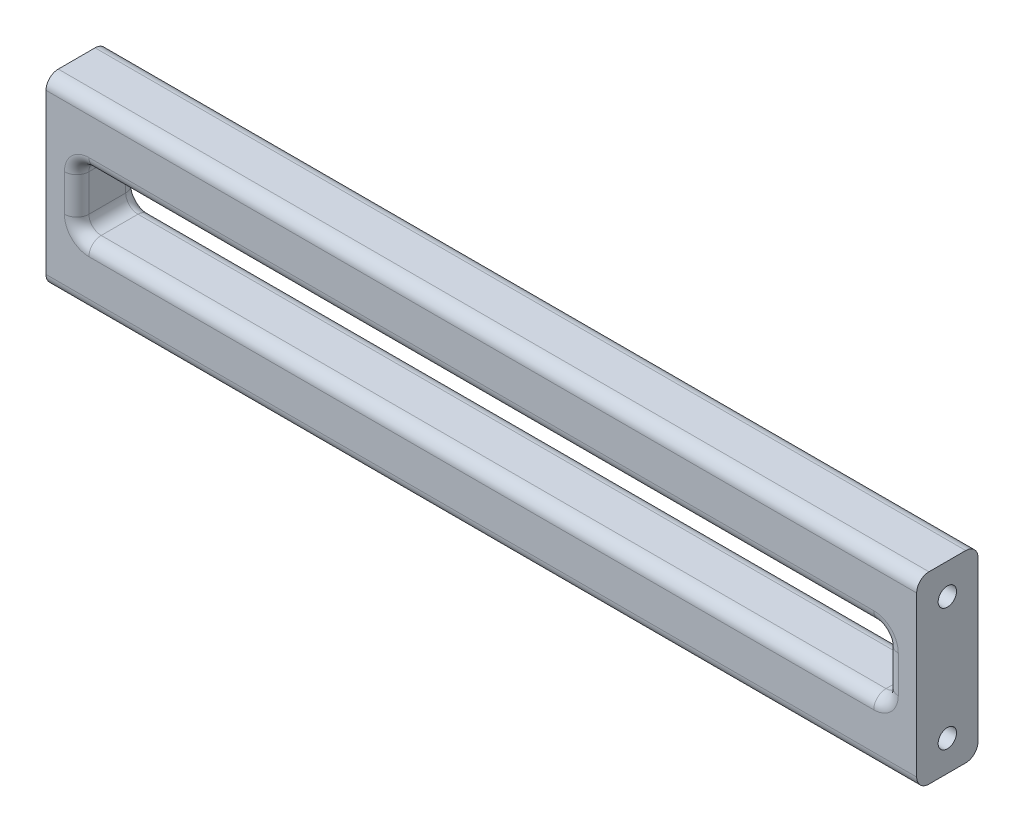
ISO-10303-21;
HEADER;
FILE_DESCRIPTION(('STEP AP214'),'2;1');
FILE_NAME('part.step','',(''),(''),'','','');
FILE_SCHEMA(('AUTOMOTIVE_DESIGN { 1 0 10303 214 1 1 1 1 }'));
ENDSEC;
DATA;
#1=APPLICATION_CONTEXT('core data for automotive mechanical design processes');
#2=APPLICATION_PROTOCOL_DEFINITION('international standard','automotive_design',2000,#1);
#3=PRODUCT_CONTEXT('',#1,'mechanical');
#4=PRODUCT('Part','Part','',(#3));
#5=PRODUCT_RELATED_PRODUCT_CATEGORY('part','',(#4));
#6=PRODUCT_DEFINITION_FORMATION('','',#4);
#7=PRODUCT_DEFINITION_CONTEXT('part definition',#1,'design');
#8=PRODUCT_DEFINITION('design','',#6,#7);
#9=PRODUCT_DEFINITION_SHAPE('','',#8);
#10=(LENGTH_UNIT() NAMED_UNIT(*) SI_UNIT(.MILLI.,.METRE.));
#11=(NAMED_UNIT(*) PLANE_ANGLE_UNIT() SI_UNIT($,.RADIAN.));
#12=(NAMED_UNIT(*) SI_UNIT($,.STERADIAN.) SOLID_ANGLE_UNIT());
#13=UNCERTAINTY_MEASURE_WITH_UNIT(LENGTH_MEASURE(1.E-05),#10,'distance_accuracy_value','');
#14=(GEOMETRIC_REPRESENTATION_CONTEXT(3) GLOBAL_UNCERTAINTY_ASSIGNED_CONTEXT((#13)) GLOBAL_UNIT_ASSIGNED_CONTEXT((#10,
#11,#12)) REPRESENTATION_CONTEXT('',''));
#15=CARTESIAN_POINT('',(0.,0.,0.));
#16=DIRECTION('',(0.,0.,1.));
#17=DIRECTION('',(1.,0.,0.));
#18=AXIS2_PLACEMENT_3D('',#15,#16,#17);
#19=CARTESIAN_POINT('',(-180.34,19.05,6.35));
#20=DIRECTION('',(0.,0.,1.));
#21=DIRECTION('',(0.,-1.,0.));
#22=AXIS2_PLACEMENT_3D('',#19,#20,#21);
#23=PLANE('',#22);
#24=DIRECTION('',(0.,-1.,0.));
#25=VECTOR('',#24,1.);
#26=CARTESIAN_POINT('',(-180.34,19.05,6.35));
#27=LINE('',#26,#25);
#28=CARTESIAN_POINT('',(-180.34,16.51,6.35));
#29=VERTEX_POINT('',#28);
#30=CARTESIAN_POINT('',(-180.34,-16.51,6.35));
#31=VERTEX_POINT('',#30);
#32=EDGE_CURVE('E413',#29,#31,#27,.T.);
#33=ORIENTED_EDGE('',*,*,#32,.T.);
#34=DIRECTION('',(1.,0.,0.));
#35=VECTOR('',#34,1.);
#36=CARTESIAN_POINT('',(-180.34,-16.51,6.35));
#37=LINE('',#36,#35);
#38=CARTESIAN_POINT('',(0.,-16.51,6.35));
#39=VERTEX_POINT('',#38);
#40=EDGE_CURVE('E261',#31,#39,#37,.T.);
#41=ORIENTED_EDGE('',*,*,#40,.T.);
#42=DIRECTION('',(0.,-1.,0.));
#43=VECTOR('',#42,1.);
#44=CARTESIAN_POINT('',(0.,19.05,6.35));
#45=LINE('',#44,#43);
#46=CARTESIAN_POINT('',(0.,16.51,6.35));
#47=VERTEX_POINT('',#46);
#48=EDGE_CURVE('E410',#47,#39,#45,.T.);
#49=ORIENTED_EDGE('',*,*,#48,.F.);
#50=DIRECTION('',(1.,0.,0.));
#51=VECTOR('',#50,1.);
#52=CARTESIAN_POINT('',(-180.34,16.51,6.35));
#53=LINE('',#52,#51);
#54=EDGE_CURVE('E259',#47,#29,#53,.F.);
#55=ORIENTED_EDGE('',*,*,#54,.T.);
#56=EDGE_LOOP('',(#33,#41,#49,#55));
#57=FACE_BOUND('',#56,.T.);
#58=CARTESIAN_POINT('',(-8.89000000000009,3.81,6.35));
#59=DIRECTION('',(0.,0.,1.));
#60=DIRECTION('',(0.,-1.,0.));
#61=AXIS2_PLACEMENT_3D('',#58,#59,#60);
#62=CIRCLE('',#61,5.08);
#63=CARTESIAN_POINT('',(-3.81000000000009,3.81,6.35));
#64=VERTEX_POINT('',#63);
#65=CARTESIAN_POINT('',(-8.89000000000009,8.89,6.35));
#66=VERTEX_POINT('',#65);
#67=EDGE_CURVE('E282',#64,#66,#62,.T.);
#68=ORIENTED_EDGE('',*,*,#67,.F.);
#69=DIRECTION('',(0.,1.,0.));
#70=VECTOR('',#69,1.);
#71=CARTESIAN_POINT('',(-3.81000000000009,-6.35,6.35));
#72=LINE('',#71,#70);
#73=CARTESIAN_POINT('',(-3.81000000000009,-3.81,6.35));
#74=VERTEX_POINT('',#73);
#75=EDGE_CURVE('E280',#64,#74,#72,.F.);
#76=ORIENTED_EDGE('',*,*,#75,.T.);
#77=CARTESIAN_POINT('',(-8.89000000000009,-3.81,6.35));
#78=DIRECTION('',(0.,0.,1.));
#79=DIRECTION('',(0.,-1.,0.));
#80=AXIS2_PLACEMENT_3D('',#77,#78,#79);
#81=CIRCLE('',#80,5.08);
#82=CARTESIAN_POINT('',(-8.89000000000009,-8.89,6.35));
#83=VERTEX_POINT('',#82);
#84=EDGE_CURVE('E277',#83,#74,#81,.T.);
#85=ORIENTED_EDGE('',*,*,#84,.F.);
#86=DIRECTION('',(1.,0.,0.));
#87=VECTOR('',#86,1.);
#88=CARTESIAN_POINT('',(-173.99,-8.89,6.35));
#89=LINE('',#88,#87);
#90=CARTESIAN_POINT('',(-171.45,-8.89,6.35));
#91=VERTEX_POINT('',#90);
#92=EDGE_CURVE('E272',#83,#91,#89,.F.);
#93=ORIENTED_EDGE('',*,*,#92,.T.);
#94=CARTESIAN_POINT('',(-171.45,-3.81,6.35));
#95=DIRECTION('',(0.,0.,1.));
#96=DIRECTION('',(0.,-1.,0.));
#97=AXIS2_PLACEMENT_3D('',#94,#95,#96);
#98=CIRCLE('',#97,5.08);
#99=CARTESIAN_POINT('',(-176.53,-3.81,6.35));
#100=VERTEX_POINT('',#99);
#101=EDGE_CURVE('E269',#100,#91,#98,.T.);
#102=ORIENTED_EDGE('',*,*,#101,.F.);
#103=DIRECTION('',(0.,-1.,0.));
#104=VECTOR('',#103,1.);
#105=CARTESIAN_POINT('',(-176.53,6.35,6.35));
#106=LINE('',#105,#104);
#107=CARTESIAN_POINT('',(-176.53,3.81,6.35));
#108=VERTEX_POINT('',#107);
#109=EDGE_CURVE('E267',#100,#108,#106,.F.);
#110=ORIENTED_EDGE('',*,*,#109,.T.);
#111=CARTESIAN_POINT('',(-171.45,3.81,6.35));
#112=DIRECTION('',(0.,0.,1.));
#113=DIRECTION('',(0.,-1.,0.));
#114=AXIS2_PLACEMENT_3D('',#111,#112,#113);
#115=CIRCLE('',#114,5.08);
#116=CARTESIAN_POINT('',(-171.45,8.89,6.35));
#117=VERTEX_POINT('',#116);
#118=EDGE_CURVE('E264',#117,#108,#115,.T.);
#119=ORIENTED_EDGE('',*,*,#118,.F.);
#120=DIRECTION('',(-1.,0.,0.));
#121=VECTOR('',#120,1.);
#122=CARTESIAN_POINT('',(-6.35000000000011,8.89,6.35));
#123=LINE('',#122,#121);
#124=EDGE_CURVE('E274',#117,#66,#123,.F.);
#125=ORIENTED_EDGE('',*,*,#124,.T.);
#126=EDGE_LOOP('',(#68,#76,#85,#93,#102,#110,#119,#125));
#127=FACE_BOUND('',#126,.T.);
#128=ADVANCED_FACE('F33',(#57,#127),#23,.T.);
#129=CARTESIAN_POINT('',(-180.34,19.05,-6.35));
#130=DIRECTION('',(0.,0.,-1.));
#131=DIRECTION('',(0.,1.,0.));
#132=AXIS2_PLACEMENT_3D('',#129,#130,#131);
#133=PLANE('',#132);
#134=DIRECTION('',(0.,1.,0.));
#135=VECTOR('',#134,1.);
#136=CARTESIAN_POINT('',(0.,19.05,-6.35));
#137=LINE('',#136,#135);
#138=CARTESIAN_POINT('',(0.,-16.51,-6.35));
#139=VERTEX_POINT('',#138);
#140=CARTESIAN_POINT('',(0.,16.51,-6.35));
#141=VERTEX_POINT('',#140);
#142=EDGE_CURVE('E200',#139,#141,#137,.T.);
#143=ORIENTED_EDGE('',*,*,#142,.F.);
#144=DIRECTION('',(1.,0.,0.));
#145=VECTOR('',#144,1.);
#146=CARTESIAN_POINT('',(-180.34,-16.51,-6.35));
#147=LINE('',#146,#145);
#148=CARTESIAN_POINT('',(-180.34,-16.51,-6.35));
#149=VERTEX_POINT('',#148);
#150=EDGE_CURVE('E215',#139,#149,#147,.F.);
#151=ORIENTED_EDGE('',*,*,#150,.T.);
#152=DIRECTION('',(0.,1.,0.));
#153=VECTOR('',#152,1.);
#154=CARTESIAN_POINT('',(-180.34,19.05,-6.35));
#155=LINE('',#154,#153);
#156=CARTESIAN_POINT('',(-180.34,16.51,-6.35));
#157=VERTEX_POINT('',#156);
#158=EDGE_CURVE('E419',#149,#157,#155,.T.);
#159=ORIENTED_EDGE('',*,*,#158,.T.);
#160=DIRECTION('',(1.,0.,0.));
#161=VECTOR('',#160,1.);
#162=CARTESIAN_POINT('',(-180.34,16.51,-6.35));
#163=LINE('',#162,#161);
#164=EDGE_CURVE('E218',#157,#141,#163,.T.);
#165=ORIENTED_EDGE('',*,*,#164,.T.);
#166=EDGE_LOOP('',(#143,#151,#159,#165));
#167=FACE_BOUND('',#166,.T.);
#168=CARTESIAN_POINT('',(-8.89000000000009,-3.81,-6.35));
#169=DIRECTION('',(0.,0.,-1.));
#170=DIRECTION('',(0.,1.,0.));
#171=AXIS2_PLACEMENT_3D('',#168,#169,#170);
#172=CIRCLE('',#171,5.08);
#173=CARTESIAN_POINT('',(-3.81000000000009,-3.81,-6.35));
#174=VERTEX_POINT('',#173);
#175=CARTESIAN_POINT('',(-8.89000000000009,-8.89,-6.35));
#176=VERTEX_POINT('',#175);
#177=EDGE_CURVE('E247',#174,#176,#172,.T.);
#178=ORIENTED_EDGE('',*,*,#177,.F.);
#179=DIRECTION('',(0.,1.,0.));
#180=VECTOR('',#179,1.);
#181=CARTESIAN_POINT('',(-3.81000000000009,6.35,-6.35));
#182=LINE('',#181,#180);
#183=CARTESIAN_POINT('',(-3.81000000000009,3.81,-6.35));
#184=VERTEX_POINT('',#183);
#185=EDGE_CURVE('E245',#174,#184,#182,.T.);
#186=ORIENTED_EDGE('',*,*,#185,.T.);
#187=CARTESIAN_POINT('',(-8.89000000000009,3.81,-6.35));
#188=DIRECTION('',(0.,0.,-1.));
#189=DIRECTION('',(0.,1.,0.));
#190=AXIS2_PLACEMENT_3D('',#187,#188,#189);
#191=CIRCLE('',#190,5.08);
#192=CARTESIAN_POINT('',(-8.89000000000009,8.89,-6.35));
#193=VERTEX_POINT('',#192);
#194=EDGE_CURVE('E242',#193,#184,#191,.T.);
#195=ORIENTED_EDGE('',*,*,#194,.F.);
#196=DIRECTION('',(-1.,0.,0.));
#197=VECTOR('',#196,1.);
#198=CARTESIAN_POINT('',(-173.99,8.89,-6.35));
#199=LINE('',#198,#197);
#200=CARTESIAN_POINT('',(-171.45,8.89,-6.35));
#201=VERTEX_POINT('',#200);
#202=EDGE_CURVE('E239',#193,#201,#199,.T.);
#203=ORIENTED_EDGE('',*,*,#202,.T.);
#204=CARTESIAN_POINT('',(-171.45,3.81,-6.35));
#205=DIRECTION('',(0.,0.,-1.));
#206=DIRECTION('',(0.,1.,0.));
#207=AXIS2_PLACEMENT_3D('',#204,#205,#206);
#208=CIRCLE('',#207,5.08);
#209=CARTESIAN_POINT('',(-176.53,3.81,-6.35));
#210=VERTEX_POINT('',#209);
#211=EDGE_CURVE('E236',#210,#201,#208,.T.);
#212=ORIENTED_EDGE('',*,*,#211,.F.);
#213=DIRECTION('',(0.,-1.,0.));
#214=VECTOR('',#213,1.);
#215=CARTESIAN_POINT('',(-176.53,-6.35,-6.35));
#216=LINE('',#215,#214);
#217=CARTESIAN_POINT('',(-176.53,-3.81,-6.35));
#218=VERTEX_POINT('',#217);
#219=EDGE_CURVE('E227',#210,#218,#216,.T.);
#220=ORIENTED_EDGE('',*,*,#219,.T.);
#221=CARTESIAN_POINT('',(-171.45,-3.81,-6.35));
#222=DIRECTION('',(0.,0.,-1.));
#223=DIRECTION('',(0.,1.,0.));
#224=AXIS2_PLACEMENT_3D('',#221,#222,#223);
#225=CIRCLE('',#224,5.08);
#226=CARTESIAN_POINT('',(-171.45,-8.89,-6.35));
#227=VERTEX_POINT('',#226);
#228=EDGE_CURVE('E224',#227,#218,#225,.T.);
#229=ORIENTED_EDGE('',*,*,#228,.F.);
#230=DIRECTION('',(1.,0.,0.));
#231=VECTOR('',#230,1.);
#232=CARTESIAN_POINT('',(-6.35000000000008,-8.89,-6.35));
#233=LINE('',#232,#231);
#234=EDGE_CURVE('E234',#227,#176,#233,.T.);
#235=ORIENTED_EDGE('',*,*,#234,.T.);
#236=EDGE_LOOP('',(#178,#186,#195,#203,#212,#220,#229,#235));
#237=FACE_BOUND('',#236,.T.);
#238=ADVANCED_FACE('F212',(#167,#237),#133,.T.);
#239=CARTESIAN_POINT('',(-180.34,19.05,-6.35));
#240=DIRECTION('',(0.,1.,0.));
#241=DIRECTION('',(0.,0.,1.));
#242=AXIS2_PLACEMENT_3D('',#239,#240,#241);
#243=PLANE('',#242);
#244=DIRECTION('',(0.,0.,1.));
#245=VECTOR('',#244,1.);
#246=CARTESIAN_POINT('',(0.,19.05,-6.35));
#247=LINE('',#246,#245);
#248=CARTESIAN_POINT('',(0.,19.05,-3.81));
#249=VERTEX_POINT('',#248);
#250=CARTESIAN_POINT('',(0.,19.05,3.81));
#251=VERTEX_POINT('',#250);
#252=EDGE_CURVE('E219',#249,#251,#247,.T.);
#253=ORIENTED_EDGE('',*,*,#252,.F.);
#254=DIRECTION('',(1.,0.,0.));
#255=VECTOR('',#254,1.);
#256=CARTESIAN_POINT('',(-180.34,19.05,-3.81));
#257=LINE('',#256,#255);
#258=CARTESIAN_POINT('',(-180.34,19.05,-3.81));
#259=VERTEX_POINT('',#258);
#260=EDGE_CURVE('E11',#249,#259,#257,.F.);
#261=ORIENTED_EDGE('',*,*,#260,.T.);
#262=DIRECTION('',(0.,0.,1.));
#263=VECTOR('',#262,1.);
#264=CARTESIAN_POINT('',(-180.34,19.05,-6.35));
#265=LINE('',#264,#263);
#266=CARTESIAN_POINT('',(-180.34,19.05,3.81));
#267=VERTEX_POINT('',#266);
#268=EDGE_CURVE('E229',#259,#267,#265,.T.);
#269=ORIENTED_EDGE('',*,*,#268,.T.);
#270=DIRECTION('',(1.,0.,0.));
#271=VECTOR('',#270,1.);
#272=CARTESIAN_POINT('',(-180.34,19.05,3.81));
#273=LINE('',#272,#271);
#274=EDGE_CURVE('E42',#267,#251,#273,.T.);
#275=ORIENTED_EDGE('',*,*,#274,.T.);
#276=EDGE_LOOP('',(#253,#261,#269,#275));
#277=FACE_BOUND('',#276,.T.);
#278=ADVANCED_FACE('F425',(#277),#243,.T.);
#279=CARTESIAN_POINT('',(-180.34,-19.05,-6.35));
#280=DIRECTION('',(0.,-1.,0.));
#281=DIRECTION('',(0.,0.,-1.));
#282=AXIS2_PLACEMENT_3D('',#279,#280,#281);
#283=PLANE('',#282);
#284=DIRECTION('',(0.,0.,-1.));
#285=VECTOR('',#284,1.);
#286=CARTESIAN_POINT('',(0.,-19.05,-6.35));
#287=LINE('',#286,#285);
#288=CARTESIAN_POINT('',(0.,-19.05,3.81));
#289=VERTEX_POINT('',#288);
#290=CARTESIAN_POINT('',(0.,-19.05,-3.81));
#291=VERTEX_POINT('',#290);
#292=EDGE_CURVE('E202',#289,#291,#287,.T.);
#293=ORIENTED_EDGE('',*,*,#292,.F.);
#294=DIRECTION('',(1.,0.,0.));
#295=VECTOR('',#294,1.);
#296=CARTESIAN_POINT('',(-180.34,-19.05,3.81));
#297=LINE('',#296,#295);
#298=CARTESIAN_POINT('',(-180.34,-19.05,3.81));
#299=VERTEX_POINT('',#298);
#300=EDGE_CURVE('E317',#289,#299,#297,.F.);
#301=ORIENTED_EDGE('',*,*,#300,.T.);
#302=DIRECTION('',(0.,0.,-1.));
#303=VECTOR('',#302,1.);
#304=CARTESIAN_POINT('',(-180.34,-19.05,-6.35));
#305=LINE('',#304,#303);
#306=CARTESIAN_POINT('',(-180.34,-19.05,-3.81));
#307=VERTEX_POINT('',#306);
#308=EDGE_CURVE('E416',#299,#307,#305,.T.);
#309=ORIENTED_EDGE('',*,*,#308,.T.);
#310=DIRECTION('',(1.,0.,0.));
#311=VECTOR('',#310,1.);
#312=CARTESIAN_POINT('',(-180.34,-19.05,-3.81));
#313=LINE('',#312,#311);
#314=EDGE_CURVE('E315',#307,#291,#313,.T.);
#315=ORIENTED_EDGE('',*,*,#314,.T.);
#316=EDGE_LOOP('',(#293,#301,#309,#315));
#317=FACE_BOUND('',#316,.T.);
#318=ADVANCED_FACE('F442',(#317),#283,.T.);
#319=CARTESIAN_POINT('',(-180.34,0.,0.));
#320=DIRECTION('',(-1.,0.,0.));
#321=DIRECTION('',(0.,0.,1.));
#322=AXIS2_PLACEMENT_3D('',#319,#320,#321);
#323=PLANE('',#322);
#324=CARTESIAN_POINT('',(-180.34,12.7,0.));
#325=DIRECTION('',(1.,0.,0.));
#326=DIRECTION('',(0.,0.,-1.));
#327=AXIS2_PLACEMENT_3D('',#324,#325,#326);
#328=CIRCLE('',#327,1.905);
#329=CARTESIAN_POINT('',(-180.34,12.7,-1.905));
#330=VERTEX_POINT('',#329);
#331=EDGE_CURVE('E399',#330,#330,#328,.T.);
#332=ORIENTED_EDGE('',*,*,#331,.T.);
#333=EDGE_LOOP('',(#332));
#334=FACE_BOUND('',#333,.T.);
#335=CARTESIAN_POINT('',(-180.34,-12.7,0.));
#336=DIRECTION('',(1.,0.,0.));
#337=DIRECTION('',(0.,0.,-1.));
#338=AXIS2_PLACEMENT_3D('',#335,#336,#337);
#339=CIRCLE('',#338,1.905);
#340=CARTESIAN_POINT('',(-180.34,-12.7,-1.905));
#341=VERTEX_POINT('',#340);
#342=EDGE_CURVE('E407',#341,#341,#339,.T.);
#343=ORIENTED_EDGE('',*,*,#342,.T.);
#344=EDGE_LOOP('',(#343));
#345=FACE_BOUND('',#344,.T.);
#346=ORIENTED_EDGE('',*,*,#308,.F.);
#347=CARTESIAN_POINT('',(-180.34,-16.51,3.81));
#348=DIRECTION('',(-1.,0.,0.));
#349=DIRECTION('',(0.,0.,1.));
#350=AXIS2_PLACEMENT_3D('',#347,#348,#349);
#351=CIRCLE('',#350,2.54);
#352=EDGE_CURVE('E323',#299,#31,#351,.T.);
#353=ORIENTED_EDGE('',*,*,#352,.T.);
#354=ORIENTED_EDGE('',*,*,#32,.F.);
#355=CARTESIAN_POINT('',(-180.34,16.51,3.81));
#356=DIRECTION('',(-1.,0.,0.));
#357=DIRECTION('',(0.,0.,1.));
#358=AXIS2_PLACEMENT_3D('',#355,#356,#357);
#359=CIRCLE('',#358,2.54);
#360=EDGE_CURVE('E50',#29,#267,#359,.T.);
#361=ORIENTED_EDGE('',*,*,#360,.T.);
#362=ORIENTED_EDGE('',*,*,#268,.F.);
#363=CARTESIAN_POINT('',(-180.34,16.51,-3.81));
#364=DIRECTION('',(-1.,0.,0.));
#365=DIRECTION('',(0.,0.,1.));
#366=AXIS2_PLACEMENT_3D('',#363,#364,#365);
#367=CIRCLE('',#366,2.54);
#368=EDGE_CURVE('E320',#259,#157,#367,.T.);
#369=ORIENTED_EDGE('',*,*,#368,.T.);
#370=ORIENTED_EDGE('',*,*,#158,.F.);
#371=CARTESIAN_POINT('',(-180.34,-16.51,-3.81));
#372=DIRECTION('',(-1.,0.,0.));
#373=DIRECTION('',(0.,0.,1.));
#374=AXIS2_PLACEMENT_3D('',#371,#372,#373);
#375=CIRCLE('',#374,2.54);
#376=EDGE_CURVE('E223',#149,#307,#375,.T.);
#377=ORIENTED_EDGE('',*,*,#376,.T.);
#378=EDGE_LOOP('',(#346,#353,#354,#361,#362,#369,#370,#377));
#379=FACE_BOUND('',#378,.T.);
#380=ADVANCED_FACE('F431',(#334,#345,#379),#323,.T.);
#381=CARTESIAN_POINT('',(0.,0.,0.));
#382=DIRECTION('',(-1.,0.,0.));
#383=DIRECTION('',(0.,0.,1.));
#384=AXIS2_PLACEMENT_3D('',#381,#382,#383);
#385=PLANE('',#384);
#386=CARTESIAN_POINT('',(0.,12.7,0.));
#387=DIRECTION('',(1.,0.,0.));
#388=DIRECTION('',(0.,0.,-1.));
#389=AXIS2_PLACEMENT_3D('',#386,#387,#388);
#390=CIRCLE('',#389,1.905);
#391=CARTESIAN_POINT('',(0.,12.7,-1.905));
#392=VERTEX_POINT('',#391);
#393=EDGE_CURVE('E394',#392,#392,#390,.T.);
#394=ORIENTED_EDGE('',*,*,#393,.F.);
#395=EDGE_LOOP('',(#394));
#396=FACE_BOUND('',#395,.T.);
#397=CARTESIAN_POINT('',(0.,-12.7,0.));
#398=DIRECTION('',(1.,0.,0.));
#399=DIRECTION('',(0.,0.,-1.));
#400=AXIS2_PLACEMENT_3D('',#397,#398,#399);
#401=CIRCLE('',#400,1.905);
#402=CARTESIAN_POINT('',(0.,-12.7,-1.905));
#403=VERTEX_POINT('',#402);
#404=EDGE_CURVE('E404',#403,#403,#401,.T.);
#405=ORIENTED_EDGE('',*,*,#404,.F.);
#406=EDGE_LOOP('',(#405));
#407=FACE_BOUND('',#406,.T.);
#408=ORIENTED_EDGE('',*,*,#48,.T.);
#409=CARTESIAN_POINT('',(0.,-16.51,3.81));
#410=DIRECTION('',(-1.,0.,0.));
#411=DIRECTION('',(0.,0.,1.));
#412=AXIS2_PLACEMENT_3D('',#409,#410,#411);
#413=CIRCLE('',#412,2.54);
#414=EDGE_CURVE('E207',#39,#289,#413,.F.);
#415=ORIENTED_EDGE('',*,*,#414,.T.);
#416=ORIENTED_EDGE('',*,*,#292,.T.);
#417=CARTESIAN_POINT('',(0.,-16.51,-3.81));
#418=DIRECTION('',(-1.,0.,0.));
#419=DIRECTION('',(0.,0.,1.));
#420=AXIS2_PLACEMENT_3D('',#417,#418,#419);
#421=CIRCLE('',#420,2.54);
#422=EDGE_CURVE('E196',#291,#139,#421,.F.);
#423=ORIENTED_EDGE('',*,*,#422,.T.);
#424=ORIENTED_EDGE('',*,*,#142,.T.);
#425=CARTESIAN_POINT('',(0.,16.51,-3.81));
#426=DIRECTION('',(-1.,0.,0.));
#427=DIRECTION('',(0.,0.,1.));
#428=AXIS2_PLACEMENT_3D('',#425,#426,#427);
#429=CIRCLE('',#428,2.54);
#430=EDGE_CURVE('E208',#141,#249,#429,.F.);
#431=ORIENTED_EDGE('',*,*,#430,.T.);
#432=ORIENTED_EDGE('',*,*,#252,.T.);
#433=CARTESIAN_POINT('',(0.,16.51,3.81));
#434=DIRECTION('',(-1.,0.,0.));
#435=DIRECTION('',(0.,0.,1.));
#436=AXIS2_PLACEMENT_3D('',#433,#434,#435);
#437=CIRCLE('',#436,2.54);
#438=EDGE_CURVE('E311',#251,#47,#437,.F.);
#439=ORIENTED_EDGE('',*,*,#438,.T.);
#440=EDGE_LOOP('',(#408,#415,#416,#423,#424,#431,#432,#439));
#441=FACE_BOUND('',#440,.T.);
#442=ADVANCED_FACE('F199',(#396,#407,#441),#385,.F.);
#443=CARTESIAN_POINT('',(-180.34,-12.7,0.));
#444=DIRECTION('',(1.,0.,0.));
#445=DIRECTION('',(0.,0.,-1.));
#446=AXIS2_PLACEMENT_3D('',#443,#444,#445);
#447=CYLINDRICAL_SURFACE('',#446,1.905);
#448=ORIENTED_EDGE('',*,*,#342,.F.);
#449=EDGE_LOOP('',(#448));
#450=FACE_BOUND('',#449,.T.);
#451=ORIENTED_EDGE('',*,*,#404,.T.);
#452=EDGE_LOOP('',(#451));
#453=FACE_BOUND('',#452,.T.);
#454=ADVANCED_FACE('F736',(#450,#453),#447,.F.);
#455=CARTESIAN_POINT('',(-180.34,12.7,0.));
#456=DIRECTION('',(1.,0.,0.));
#457=DIRECTION('',(0.,0.,-1.));
#458=AXIS2_PLACEMENT_3D('',#455,#456,#457);
#459=CYLINDRICAL_SURFACE('',#458,1.905);
#460=ORIENTED_EDGE('',*,*,#331,.F.);
#461=EDGE_LOOP('',(#460));
#462=FACE_BOUND('',#461,.T.);
#463=ORIENTED_EDGE('',*,*,#393,.T.);
#464=EDGE_LOOP('',(#463));
#465=FACE_BOUND('',#464,.T.);
#466=ADVANCED_FACE('F724',(#462,#465),#459,.F.);
#467=CARTESIAN_POINT('',(-6.35000000000009,-6.35,-6.35));
#468=DIRECTION('',(1.,0.,0.));
#469=DIRECTION('',(0.,0.,-1.));
#470=AXIS2_PLACEMENT_3D('',#467,#468,#469);
#471=PLANE('',#470);
#472=DIRECTION('',(0.,1.,0.));
#473=VECTOR('',#472,1.);
#474=CARTESIAN_POINT('',(-6.35000000000009,-6.35,-3.81));
#475=LINE('',#474,#473);
#476=CARTESIAN_POINT('',(-6.35000000000009,3.81,-3.81));
#477=VERTEX_POINT('',#476);
#478=CARTESIAN_POINT('',(-6.35000000000009,-3.81,-3.81));
#479=VERTEX_POINT('',#478);
#480=EDGE_CURVE('E297',#477,#479,#475,.F.);
#481=ORIENTED_EDGE('',*,*,#480,.T.);
#482=DIRECTION('',(0.,0.,1.));
#483=VECTOR('',#482,1.);
#484=CARTESIAN_POINT('',(-6.35000000000009,-3.81,6.35));
#485=LINE('',#484,#483);
#486=CARTESIAN_POINT('',(-6.35000000000009,-3.81,3.81));
#487=VERTEX_POINT('',#486);
#488=EDGE_CURVE('E299',#479,#487,#485,.T.);
#489=ORIENTED_EDGE('',*,*,#488,.T.);
#490=DIRECTION('',(0.,1.,0.));
#491=VECTOR('',#490,1.);
#492=CARTESIAN_POINT('',(-6.35000000000009,6.35,3.81));
#493=LINE('',#492,#491);
#494=CARTESIAN_POINT('',(-6.35000000000009,3.81,3.81));
#495=VERTEX_POINT('',#494);
#496=EDGE_CURVE('E293',#487,#495,#493,.T.);
#497=ORIENTED_EDGE('',*,*,#496,.T.);
#498=DIRECTION('',(0.,0.,1.));
#499=VECTOR('',#498,1.);
#500=CARTESIAN_POINT('',(-6.35000000000009,3.81,-6.35));
#501=LINE('',#500,#499);
#502=EDGE_CURVE('E295',#495,#477,#501,.F.);
#503=ORIENTED_EDGE('',*,*,#502,.T.);
#504=EDGE_LOOP('',(#481,#489,#497,#503));
#505=FACE_BOUND('',#504,.T.);
#506=ADVANCED_FACE('F714',(#505),#471,.F.);
#507=CARTESIAN_POINT('',(-173.99,-6.35,-6.35));
#508=DIRECTION('',(0.,-1.,0.));
#509=DIRECTION('',(0.,0.,-1.));
#510=AXIS2_PLACEMENT_3D('',#507,#508,#509);
#511=PLANE('',#510);
#512=DIRECTION('',(1.,0.,0.));
#513=VECTOR('',#512,1.);
#514=CARTESIAN_POINT('',(-6.35000000000008,-6.35,3.81));
#515=LINE('',#514,#513);
#516=CARTESIAN_POINT('',(-171.45,-6.35,3.81));
#517=VERTEX_POINT('',#516);
#518=CARTESIAN_POINT('',(-8.89000000000009,-6.35,3.81));
#519=VERTEX_POINT('',#518);
#520=EDGE_CURVE('E286',#517,#519,#515,.T.);
#521=ORIENTED_EDGE('',*,*,#520,.T.);
#522=DIRECTION('',(0.,0.,1.));
#523=VECTOR('',#522,1.);
#524=CARTESIAN_POINT('',(-8.89000000000009,-6.35,-6.35));
#525=LINE('',#524,#523);
#526=CARTESIAN_POINT('',(-8.89000000000009,-6.35,-3.81));
#527=VERTEX_POINT('',#526);
#528=EDGE_CURVE('E291',#519,#527,#525,.F.);
#529=ORIENTED_EDGE('',*,*,#528,.T.);
#530=DIRECTION('',(1.,0.,0.));
#531=VECTOR('',#530,1.);
#532=CARTESIAN_POINT('',(-173.99,-6.35,-3.81));
#533=LINE('',#532,#531);
#534=CARTESIAN_POINT('',(-171.45,-6.35,-3.81));
#535=VERTEX_POINT('',#534);
#536=EDGE_CURVE('E288',#527,#535,#533,.F.);
#537=ORIENTED_EDGE('',*,*,#536,.T.);
#538=DIRECTION('',(0.,0.,1.));
#539=VECTOR('',#538,1.);
#540=CARTESIAN_POINT('',(-171.45,-6.35,6.35));
#541=LINE('',#540,#539);
#542=EDGE_CURVE('E284',#535,#517,#541,.T.);
#543=ORIENTED_EDGE('',*,*,#542,.T.);
#544=EDGE_LOOP('',(#521,#529,#537,#543));
#545=FACE_BOUND('',#544,.T.);
#546=ADVANCED_FACE('F704',(#545),#511,.F.);
#547=CARTESIAN_POINT('',(-173.99,-6.35,-6.35));
#548=DIRECTION('',(-1.,0.,0.));
#549=DIRECTION('',(0.,0.,1.));
#550=AXIS2_PLACEMENT_3D('',#547,#548,#549);
#551=PLANE('',#550);
#552=DIRECTION('',(0.,-1.,0.));
#553=VECTOR('',#552,1.);
#554=CARTESIAN_POINT('',(-173.99,6.35,-3.81));
#555=LINE('',#554,#553);
#556=CARTESIAN_POINT('',(-173.99,-3.81,-3.81));
#557=VERTEX_POINT('',#556);
#558=CARTESIAN_POINT('',(-173.99,3.81,-3.81));
#559=VERTEX_POINT('',#558);
#560=EDGE_CURVE('E306',#557,#559,#555,.F.);
#561=ORIENTED_EDGE('',*,*,#560,.T.);
#562=DIRECTION('',(0.,0.,1.));
#563=VECTOR('',#562,1.);
#564=CARTESIAN_POINT('',(-173.99,3.81,6.35));
#565=LINE('',#564,#563);
#566=CARTESIAN_POINT('',(-173.99,3.81,3.81));
#567=VERTEX_POINT('',#566);
#568=EDGE_CURVE('E308',#559,#567,#565,.T.);
#569=ORIENTED_EDGE('',*,*,#568,.T.);
#570=DIRECTION('',(0.,-1.,0.));
#571=VECTOR('',#570,1.);
#572=CARTESIAN_POINT('',(-173.99,-6.35,3.81));
#573=LINE('',#572,#571);
#574=CARTESIAN_POINT('',(-173.99,-3.81,3.81));
#575=VERTEX_POINT('',#574);
#576=EDGE_CURVE('E302',#567,#575,#573,.T.);
#577=ORIENTED_EDGE('',*,*,#576,.T.);
#578=DIRECTION('',(0.,0.,1.));
#579=VECTOR('',#578,1.);
#580=CARTESIAN_POINT('',(-173.99,-3.81,-6.35));
#581=LINE('',#580,#579);
#582=EDGE_CURVE('E304',#575,#557,#581,.F.);
#583=ORIENTED_EDGE('',*,*,#582,.T.);
#584=EDGE_LOOP('',(#561,#569,#577,#583));
#585=FACE_BOUND('',#584,.T.);
#586=ADVANCED_FACE('F693',(#585),#551,.F.);
#587=CARTESIAN_POINT('',(-173.99,6.35,-6.35));
#588=DIRECTION('',(0.,1.,0.));
#589=DIRECTION('',(0.,0.,1.));
#590=AXIS2_PLACEMENT_3D('',#587,#588,#589);
#591=PLANE('',#590);
#592=DIRECTION('',(-1.,0.,0.));
#593=VECTOR('',#592,1.);
#594=CARTESIAN_POINT('',(-6.35000000000008,6.35,-3.81));
#595=LINE('',#594,#593);
#596=CARTESIAN_POINT('',(-171.45,6.35,-3.81));
#597=VERTEX_POINT('',#596);
#598=CARTESIAN_POINT('',(-8.89000000000009,6.35,-3.81));
#599=VERTEX_POINT('',#598);
#600=EDGE_CURVE('E254',#597,#599,#595,.F.);
#601=ORIENTED_EDGE('',*,*,#600,.T.);
#602=DIRECTION('',(0.,0.,1.));
#603=VECTOR('',#602,1.);
#604=CARTESIAN_POINT('',(-8.89000000000009,6.35,6.35));
#605=LINE('',#604,#603);
#606=CARTESIAN_POINT('',(-8.89000000000009,6.35,3.81));
#607=VERTEX_POINT('',#606);
#608=EDGE_CURVE('E257',#599,#607,#605,.T.);
#609=ORIENTED_EDGE('',*,*,#608,.T.);
#610=DIRECTION('',(-1.,0.,0.));
#611=VECTOR('',#610,1.);
#612=CARTESIAN_POINT('',(-173.99,6.35,3.81));
#613=LINE('',#612,#611);
#614=CARTESIAN_POINT('',(-171.45,6.35,3.81));
#615=VERTEX_POINT('',#614);
#616=EDGE_CURVE('E252',#607,#615,#613,.T.);
#617=ORIENTED_EDGE('',*,*,#616,.T.);
#618=DIRECTION('',(0.,0.,1.));
#619=VECTOR('',#618,1.);
#620=CARTESIAN_POINT('',(-171.45,6.35,-6.35));
#621=LINE('',#620,#619);
#622=EDGE_CURVE('E250',#615,#597,#621,.F.);
#623=ORIENTED_EDGE('',*,*,#622,.T.);
#624=EDGE_LOOP('',(#601,#609,#617,#623));
#625=FACE_BOUND('',#624,.T.);
#626=ADVANCED_FACE('F536',(#625),#591,.F.);
#627=CARTESIAN_POINT('',(-173.99,-8.89,3.81));
#628=DIRECTION('',(-1.,0.,0.));
#629=DIRECTION('',(0.,0.,1.));
#630=AXIS2_PLACEMENT_3D('',#627,#628,#629);
#631=CYLINDRICAL_SURFACE('',#630,2.54);
#632=CARTESIAN_POINT('',(-171.45,-8.89,3.81));
#633=DIRECTION('',(-1.,0.,0.));
#634=DIRECTION('',(0.,0.,1.));
#635=AXIS2_PLACEMENT_3D('',#632,#633,#634);
#636=CIRCLE('',#635,2.54);
#637=EDGE_CURVE('E388',#91,#517,#636,.T.);
#638=ORIENTED_EDGE('',*,*,#637,.F.);
#639=ORIENTED_EDGE('',*,*,#92,.F.);
#640=CARTESIAN_POINT('',(-8.89000000000009,-8.89,3.81));
#641=DIRECTION('',(1.,0.,0.));
#642=DIRECTION('',(0.,0.,-1.));
#643=AXIS2_PLACEMENT_3D('',#640,#641,#642);
#644=CIRCLE('',#643,2.54);
#645=EDGE_CURVE('E37',#519,#83,#644,.T.);
#646=ORIENTED_EDGE('',*,*,#645,.F.);
#647=ORIENTED_EDGE('',*,*,#520,.F.);
#648=EDGE_LOOP('',(#638,#639,#646,#647));
#649=FACE_BOUND('',#648,.T.);
#650=ADVANCED_FACE('F533',(#649),#631,.T.);
#651=CARTESIAN_POINT('',(-8.89000000000009,-3.81,3.81));
#652=DIRECTION('',(0.,0.,1.));
#653=DIRECTION('',(0.,-1.,0.));
#654=AXIS2_PLACEMENT_3D('',#651,#652,#653);
#655=TOROIDAL_SURFACE('',#654,5.08,2.54);
#656=ORIENTED_EDGE('',*,*,#645,.T.);
#657=ORIENTED_EDGE('',*,*,#84,.T.);
#658=CARTESIAN_POINT('',(-3.81000000000009,-3.81,3.81));
#659=DIRECTION('',(0.,-1.,0.));
#660=DIRECTION('',(0.,0.,-1.));
#661=AXIS2_PLACEMENT_3D('',#658,#659,#660);
#662=CIRCLE('',#661,2.54);
#663=EDGE_CURVE('E386',#487,#74,#662,.F.);
#664=ORIENTED_EDGE('',*,*,#663,.F.);
#665=CARTESIAN_POINT('',(-8.89000000000009,-3.81,3.81));
#666=DIRECTION('',(0.,0.,1.));
#667=DIRECTION('',(0.,-1.,0.));
#668=AXIS2_PLACEMENT_3D('',#665,#666,#667);
#669=CIRCLE('',#668,2.54);
#670=EDGE_CURVE('E383',#519,#487,#669,.T.);
#671=ORIENTED_EDGE('',*,*,#670,.F.);
#672=EDGE_LOOP('',(#656,#657,#664,#671));
#673=FACE_BOUND('',#672,.T.);
#674=ADVANCED_FACE('F530',(#673),#655,.T.);
#675=CARTESIAN_POINT('',(-171.45,-3.81,3.81));
#676=DIRECTION('',(0.,0.,1.));
#677=DIRECTION('',(0.,-1.,0.));
#678=AXIS2_PLACEMENT_3D('',#675,#676,#677);
#679=TOROIDAL_SURFACE('',#678,5.08,2.54);
#680=ORIENTED_EDGE('',*,*,#101,.T.);
#681=ORIENTED_EDGE('',*,*,#637,.T.);
#682=CARTESIAN_POINT('',(-171.45,-3.81,3.81));
#683=DIRECTION('',(0.,0.,1.));
#684=DIRECTION('',(0.,-1.,0.));
#685=AXIS2_PLACEMENT_3D('',#682,#683,#684);
#686=CIRCLE('',#685,2.54);
#687=EDGE_CURVE('E380',#575,#517,#686,.T.);
#688=ORIENTED_EDGE('',*,*,#687,.F.);
#689=CARTESIAN_POINT('',(-176.53,-3.81,3.81));
#690=DIRECTION('',(0.,-1.,0.));
#691=DIRECTION('',(0.,0.,-1.));
#692=AXIS2_PLACEMENT_3D('',#689,#690,#691);
#693=CIRCLE('',#692,2.54);
#694=EDGE_CURVE('E377',#100,#575,#693,.F.);
#695=ORIENTED_EDGE('',*,*,#694,.F.);
#696=EDGE_LOOP('',(#680,#681,#688,#695));
#697=FACE_BOUND('',#696,.T.);
#698=ADVANCED_FACE('F526',(#697),#679,.T.);
#699=CARTESIAN_POINT('',(-3.81000000000009,-6.35,3.81));
#700=DIRECTION('',(0.,-1.,0.));
#701=DIRECTION('',(0.,0.,-1.));
#702=AXIS2_PLACEMENT_3D('',#699,#700,#701);
#703=CYLINDRICAL_SURFACE('',#702,2.54);
#704=ORIENTED_EDGE('',*,*,#663,.T.);
#705=ORIENTED_EDGE('',*,*,#75,.F.);
#706=CARTESIAN_POINT('',(-3.81000000000009,3.81,3.81));
#707=DIRECTION('',(0.,1.,0.));
#708=DIRECTION('',(0.,0.,1.));
#709=AXIS2_PLACEMENT_3D('',#706,#707,#708);
#710=CIRCLE('',#709,2.54);
#711=EDGE_CURVE('E371',#495,#64,#710,.T.);
#712=ORIENTED_EDGE('',*,*,#711,.F.);
#713=ORIENTED_EDGE('',*,*,#496,.F.);
#714=EDGE_LOOP('',(#704,#705,#712,#713));
#715=FACE_BOUND('',#714,.T.);
#716=ADVANCED_FACE('F522',(#715),#703,.T.);
#717=CARTESIAN_POINT('',(-8.89000000000009,-3.81,-6.35));
#718=DIRECTION('',(0.,0.,-1.));
#719=DIRECTION('',(-1.,0.,0.));
#720=AXIS2_PLACEMENT_3D('',#717,#718,#719);
#721=CYLINDRICAL_SURFACE('',#720,2.54);
#722=ORIENTED_EDGE('',*,*,#670,.T.);
#723=ORIENTED_EDGE('',*,*,#488,.F.);
#724=CARTESIAN_POINT('',(-8.89000000000009,-3.81,-3.81));
#725=DIRECTION('',(0.,0.,-1.));
#726=DIRECTION('',(0.,1.,0.));
#727=AXIS2_PLACEMENT_3D('',#724,#725,#726);
#728=CIRCLE('',#727,2.54);
#729=EDGE_CURVE('E368',#527,#479,#728,.F.);
#730=ORIENTED_EDGE('',*,*,#729,.F.);
#731=ORIENTED_EDGE('',*,*,#528,.F.);
#732=EDGE_LOOP('',(#722,#723,#730,#731));
#733=FACE_BOUND('',#732,.T.);
#734=ADVANCED_FACE('F518',(#733),#721,.F.);
#735=CARTESIAN_POINT('',(-180.34,-8.89,-3.81));
#736=DIRECTION('',(-1.,0.,0.));
#737=DIRECTION('',(0.,0.,1.));
#738=AXIS2_PLACEMENT_3D('',#735,#736,#737);
#739=CYLINDRICAL_SURFACE('',#738,2.54);
#740=CARTESIAN_POINT('',(-171.45,-8.89,-3.81));
#741=DIRECTION('',(-1.,0.,0.));
#742=DIRECTION('',(0.,0.,1.));
#743=AXIS2_PLACEMENT_3D('',#740,#741,#742);
#744=CIRCLE('',#743,2.54);
#745=EDGE_CURVE('E362',#535,#227,#744,.T.);
#746=ORIENTED_EDGE('',*,*,#745,.F.);
#747=ORIENTED_EDGE('',*,*,#536,.F.);
#748=CARTESIAN_POINT('',(-8.89000000000009,-8.89,-3.81));
#749=DIRECTION('',(1.,0.,0.));
#750=DIRECTION('',(0.,0.,-1.));
#751=AXIS2_PLACEMENT_3D('',#748,#749,#750);
#752=CIRCLE('',#751,2.54);
#753=EDGE_CURVE('E365',#176,#527,#752,.T.);
#754=ORIENTED_EDGE('',*,*,#753,.F.);
#755=ORIENTED_EDGE('',*,*,#234,.F.);
#756=EDGE_LOOP('',(#746,#747,#754,#755));
#757=FACE_BOUND('',#756,.T.);
#758=ADVANCED_FACE('F514',(#757),#739,.T.);
#759=CARTESIAN_POINT('',(-171.45,-3.81,-6.35));
#760=DIRECTION('',(0.,0.,-1.));
#761=DIRECTION('',(-1.,0.,0.));
#762=AXIS2_PLACEMENT_3D('',#759,#760,#761);
#763=CYLINDRICAL_SURFACE('',#762,2.54);
#764=ORIENTED_EDGE('',*,*,#687,.T.);
#765=ORIENTED_EDGE('',*,*,#542,.F.);
#766=CARTESIAN_POINT('',(-171.45,-3.81,-3.81));
#767=DIRECTION('',(0.,0.,-1.));
#768=DIRECTION('',(0.,1.,0.));
#769=AXIS2_PLACEMENT_3D('',#766,#767,#768);
#770=CIRCLE('',#769,2.54);
#771=EDGE_CURVE('E360',#557,#535,#770,.F.);
#772=ORIENTED_EDGE('',*,*,#771,.F.);
#773=ORIENTED_EDGE('',*,*,#582,.F.);
#774=EDGE_LOOP('',(#764,#765,#772,#773));
#775=FACE_BOUND('',#774,.T.);
#776=ADVANCED_FACE('F510',(#775),#763,.F.);
#777=CARTESIAN_POINT('',(-176.53,-6.35,3.81));
#778=DIRECTION('',(0.,1.,0.));
#779=DIRECTION('',(0.,0.,1.));
#780=AXIS2_PLACEMENT_3D('',#777,#778,#779);
#781=CYLINDRICAL_SURFACE('',#780,2.54);
#782=ORIENTED_EDGE('',*,*,#694,.T.);
#783=ORIENTED_EDGE('',*,*,#576,.F.);
#784=CARTESIAN_POINT('',(-176.53,3.81,3.81));
#785=DIRECTION('',(0.,1.,0.));
#786=DIRECTION('',(0.,0.,1.));
#787=AXIS2_PLACEMENT_3D('',#784,#785,#786);
#788=CIRCLE('',#787,2.54);
#789=EDGE_CURVE('E357',#108,#567,#788,.T.);
#790=ORIENTED_EDGE('',*,*,#789,.F.);
#791=ORIENTED_EDGE('',*,*,#109,.F.);
#792=EDGE_LOOP('',(#782,#783,#790,#791));
#793=FACE_BOUND('',#792,.T.);
#794=ADVANCED_FACE('F506',(#793),#781,.T.);
#795=CARTESIAN_POINT('',(-173.99,8.89,3.81));
#796=DIRECTION('',(1.,0.,0.));
#797=DIRECTION('',(0.,0.,-1.));
#798=AXIS2_PLACEMENT_3D('',#795,#796,#797);
#799=CYLINDRICAL_SURFACE('',#798,2.54);
#800=CARTESIAN_POINT('',(-8.89000000000009,8.89,3.81));
#801=DIRECTION('',(1.,0.,0.));
#802=DIRECTION('',(0.,0.,-1.));
#803=AXIS2_PLACEMENT_3D('',#800,#801,#802);
#804=CIRCLE('',#803,2.54);
#805=EDGE_CURVE('E374',#66,#607,#804,.T.);
#806=ORIENTED_EDGE('',*,*,#805,.F.);
#807=ORIENTED_EDGE('',*,*,#124,.F.);
#808=CARTESIAN_POINT('',(-171.45,8.89,3.81));
#809=DIRECTION('',(-1.,0.,0.));
#810=DIRECTION('',(0.,0.,1.));
#811=AXIS2_PLACEMENT_3D('',#808,#809,#810);
#812=CIRCLE('',#811,2.54);
#813=EDGE_CURVE('E354',#615,#117,#812,.T.);
#814=ORIENTED_EDGE('',*,*,#813,.F.);
#815=ORIENTED_EDGE('',*,*,#616,.F.);
#816=EDGE_LOOP('',(#806,#807,#814,#815));
#817=FACE_BOUND('',#816,.T.);
#818=ADVANCED_FACE('F502',(#817),#799,.T.);
#819=CARTESIAN_POINT('',(-8.89000000000009,3.81,3.81));
#820=DIRECTION('',(0.,0.,1.));
#821=DIRECTION('',(0.,-1.,0.));
#822=AXIS2_PLACEMENT_3D('',#819,#820,#821);
#823=TOROIDAL_SURFACE('',#822,5.08,2.54);
#824=ORIENTED_EDGE('',*,*,#67,.T.);
#825=ORIENTED_EDGE('',*,*,#805,.T.);
#826=CARTESIAN_POINT('',(-8.89000000000009,3.81,3.81));
#827=DIRECTION('',(0.,0.,1.));
#828=DIRECTION('',(0.,-1.,0.));
#829=AXIS2_PLACEMENT_3D('',#826,#827,#828);
#830=CIRCLE('',#829,2.54);
#831=EDGE_CURVE('E351',#495,#607,#830,.T.);
#832=ORIENTED_EDGE('',*,*,#831,.F.);
#833=ORIENTED_EDGE('',*,*,#711,.T.);
#834=EDGE_LOOP('',(#824,#825,#832,#833));
#835=FACE_BOUND('',#834,.T.);
#836=ADVANCED_FACE('F498',(#835),#823,.T.);
#837=CARTESIAN_POINT('',(-8.89000000000009,-3.81,-3.81));
#838=DIRECTION('',(0.,0.,-1.));
#839=DIRECTION('',(0.,1.,0.));
#840=AXIS2_PLACEMENT_3D('',#837,#838,#839);
#841=TOROIDAL_SURFACE('',#840,5.08,2.54);
#842=ORIENTED_EDGE('',*,*,#753,.T.);
#843=ORIENTED_EDGE('',*,*,#729,.T.);
#844=CARTESIAN_POINT('',(-3.81000000000009,-3.81,-3.81));
#845=DIRECTION('',(0.,-1.,0.));
#846=DIRECTION('',(0.,0.,-1.));
#847=AXIS2_PLACEMENT_3D('',#844,#845,#846);
#848=CIRCLE('',#847,2.54);
#849=EDGE_CURVE('E348',#174,#479,#848,.F.);
#850=ORIENTED_EDGE('',*,*,#849,.F.);
#851=ORIENTED_EDGE('',*,*,#177,.T.);
#852=EDGE_LOOP('',(#842,#843,#850,#851));
#853=FACE_BOUND('',#852,.T.);
#854=ADVANCED_FACE('F494',(#853),#841,.T.);
#855=CARTESIAN_POINT('',(-171.45,-3.81,-3.81));
#856=DIRECTION('',(0.,0.,-1.));
#857=DIRECTION('',(0.,1.,0.));
#858=AXIS2_PLACEMENT_3D('',#855,#856,#857);
#859=TOROIDAL_SURFACE('',#858,5.08,2.54);
#860=ORIENTED_EDGE('',*,*,#745,.T.);
#861=ORIENTED_EDGE('',*,*,#228,.T.);
#862=CARTESIAN_POINT('',(-176.53,-3.81,-3.81));
#863=DIRECTION('',(0.,-1.,0.));
#864=DIRECTION('',(0.,0.,-1.));
#865=AXIS2_PLACEMENT_3D('',#862,#863,#864);
#866=CIRCLE('',#865,2.54);
#867=EDGE_CURVE('E345',#557,#218,#866,.F.);
#868=ORIENTED_EDGE('',*,*,#867,.F.);
#869=ORIENTED_EDGE('',*,*,#771,.T.);
#870=EDGE_LOOP('',(#860,#861,#868,#869));
#871=FACE_BOUND('',#870,.T.);
#872=ADVANCED_FACE('F490',(#871),#859,.T.);
#873=CARTESIAN_POINT('',(-171.45,3.81,3.81));
#874=DIRECTION('',(0.,0.,1.));
#875=DIRECTION('',(0.,-1.,0.));
#876=AXIS2_PLACEMENT_3D('',#873,#874,#875);
#877=TOROIDAL_SURFACE('',#876,5.08,2.54);
#878=ORIENTED_EDGE('',*,*,#118,.T.);
#879=ORIENTED_EDGE('',*,*,#789,.T.);
#880=CARTESIAN_POINT('',(-171.45,3.81,3.81));
#881=DIRECTION('',(0.,0.,1.));
#882=DIRECTION('',(0.,-1.,0.));
#883=AXIS2_PLACEMENT_3D('',#880,#881,#882);
#884=CIRCLE('',#883,2.54);
#885=EDGE_CURVE('E343',#615,#567,#884,.T.);
#886=ORIENTED_EDGE('',*,*,#885,.F.);
#887=ORIENTED_EDGE('',*,*,#813,.T.);
#888=EDGE_LOOP('',(#878,#879,#886,#887));
#889=FACE_BOUND('',#888,.T.);
#890=ADVANCED_FACE('F486',(#889),#877,.T.);
#891=CARTESIAN_POINT('',(-8.89000000000009,3.81,-6.35));
#892=DIRECTION('',(0.,0.,-1.));
#893=DIRECTION('',(-1.,0.,0.));
#894=AXIS2_PLACEMENT_3D('',#891,#892,#893);
#895=CYLINDRICAL_SURFACE('',#894,2.54);
#896=ORIENTED_EDGE('',*,*,#831,.T.);
#897=ORIENTED_EDGE('',*,*,#608,.F.);
#898=CARTESIAN_POINT('',(-8.89000000000009,3.81,-3.81));
#899=DIRECTION('',(0.,0.,-1.));
#900=DIRECTION('',(0.,1.,0.));
#901=AXIS2_PLACEMENT_3D('',#898,#899,#900);
#902=CIRCLE('',#901,2.54);
#903=EDGE_CURVE('E340',#477,#599,#902,.F.);
#904=ORIENTED_EDGE('',*,*,#903,.F.);
#905=ORIENTED_EDGE('',*,*,#502,.F.);
#906=EDGE_LOOP('',(#896,#897,#904,#905));
#907=FACE_BOUND('',#906,.T.);
#908=ADVANCED_FACE('F482',(#907),#895,.F.);
#909=CARTESIAN_POINT('',(-3.81000000000009,19.05,-3.81));
#910=DIRECTION('',(0.,-1.,0.));
#911=DIRECTION('',(0.,0.,-1.));
#912=AXIS2_PLACEMENT_3D('',#909,#910,#911);
#913=CYLINDRICAL_SURFACE('',#912,2.54);
#914=ORIENTED_EDGE('',*,*,#849,.T.);
#915=ORIENTED_EDGE('',*,*,#480,.F.);
#916=CARTESIAN_POINT('',(-3.81000000000009,3.81,-3.81));
#917=DIRECTION('',(0.,1.,0.));
#918=DIRECTION('',(0.,0.,1.));
#919=AXIS2_PLACEMENT_3D('',#916,#917,#918);
#920=CIRCLE('',#919,2.54);
#921=EDGE_CURVE('E337',#184,#477,#920,.T.);
#922=ORIENTED_EDGE('',*,*,#921,.F.);
#923=ORIENTED_EDGE('',*,*,#185,.F.);
#924=EDGE_LOOP('',(#914,#915,#922,#923));
#925=FACE_BOUND('',#924,.T.);
#926=ADVANCED_FACE('F478',(#925),#913,.T.);
#927=CARTESIAN_POINT('',(-176.53,19.05,-3.81));
#928=DIRECTION('',(0.,1.,0.));
#929=DIRECTION('',(0.,0.,1.));
#930=AXIS2_PLACEMENT_3D('',#927,#928,#929);
#931=CYLINDRICAL_SURFACE('',#930,2.54);
#932=ORIENTED_EDGE('',*,*,#867,.T.);
#933=ORIENTED_EDGE('',*,*,#219,.F.);
#934=CARTESIAN_POINT('',(-176.53,3.81,-3.81));
#935=DIRECTION('',(0.,1.,0.));
#936=DIRECTION('',(0.,0.,1.));
#937=AXIS2_PLACEMENT_3D('',#934,#935,#936);
#938=CIRCLE('',#937,2.54);
#939=EDGE_CURVE('E334',#559,#210,#938,.T.);
#940=ORIENTED_EDGE('',*,*,#939,.F.);
#941=ORIENTED_EDGE('',*,*,#560,.F.);
#942=EDGE_LOOP('',(#932,#933,#940,#941));
#943=FACE_BOUND('',#942,.T.);
#944=ADVANCED_FACE('F474',(#943),#931,.T.);
#945=CARTESIAN_POINT('',(-171.45,3.81,-6.35));
#946=DIRECTION('',(0.,0.,-1.));
#947=DIRECTION('',(-1.,0.,0.));
#948=AXIS2_PLACEMENT_3D('',#945,#946,#947);
#949=CYLINDRICAL_SURFACE('',#948,2.54);
#950=ORIENTED_EDGE('',*,*,#885,.T.);
#951=ORIENTED_EDGE('',*,*,#568,.F.);
#952=CARTESIAN_POINT('',(-171.45,3.81,-3.81));
#953=DIRECTION('',(0.,0.,-1.));
#954=DIRECTION('',(0.,1.,0.));
#955=AXIS2_PLACEMENT_3D('',#952,#953,#954);
#956=CIRCLE('',#955,2.54);
#957=EDGE_CURVE('E331',#597,#559,#956,.F.);
#958=ORIENTED_EDGE('',*,*,#957,.F.);
#959=ORIENTED_EDGE('',*,*,#622,.F.);
#960=EDGE_LOOP('',(#950,#951,#958,#959));
#961=FACE_BOUND('',#960,.T.);
#962=ADVANCED_FACE('F470',(#961),#949,.F.);
#963=CARTESIAN_POINT('',(-8.89000000000009,3.81,-3.81));
#964=DIRECTION('',(0.,0.,-1.));
#965=DIRECTION('',(0.,1.,0.));
#966=AXIS2_PLACEMENT_3D('',#963,#964,#965);
#967=TOROIDAL_SURFACE('',#966,5.08,2.54);
#968=ORIENTED_EDGE('',*,*,#921,.T.);
#969=ORIENTED_EDGE('',*,*,#903,.T.);
#970=CARTESIAN_POINT('',(-8.89000000000009,8.89,-3.81));
#971=DIRECTION('',(1.,0.,0.));
#972=DIRECTION('',(0.,0.,-1.));
#973=AXIS2_PLACEMENT_3D('',#970,#971,#972);
#974=CIRCLE('',#973,2.54);
#975=EDGE_CURVE('E329',#193,#599,#974,.F.);
#976=ORIENTED_EDGE('',*,*,#975,.F.);
#977=ORIENTED_EDGE('',*,*,#194,.T.);
#978=EDGE_LOOP('',(#968,#969,#976,#977));
#979=FACE_BOUND('',#978,.T.);
#980=ADVANCED_FACE('F466',(#979),#967,.T.);
#981=CARTESIAN_POINT('',(-171.45,3.81,-3.81));
#982=DIRECTION('',(0.,0.,-1.));
#983=DIRECTION('',(0.,1.,0.));
#984=AXIS2_PLACEMENT_3D('',#981,#982,#983);
#985=TOROIDAL_SURFACE('',#984,5.08,2.54);
#986=ORIENTED_EDGE('',*,*,#939,.T.);
#987=ORIENTED_EDGE('',*,*,#211,.T.);
#988=CARTESIAN_POINT('',(-171.45,8.89,-3.81));
#989=DIRECTION('',(-1.,0.,0.));
#990=DIRECTION('',(0.,0.,1.));
#991=AXIS2_PLACEMENT_3D('',#988,#989,#990);
#992=CIRCLE('',#991,2.54);
#993=EDGE_CURVE('E327',#597,#201,#992,.F.);
#994=ORIENTED_EDGE('',*,*,#993,.F.);
#995=ORIENTED_EDGE('',*,*,#957,.T.);
#996=EDGE_LOOP('',(#986,#987,#994,#995));
#997=FACE_BOUND('',#996,.T.);
#998=ADVANCED_FACE('F462',(#997),#985,.T.);
#999=CARTESIAN_POINT('',(-180.34,8.89,-3.81));
#1000=DIRECTION('',(1.,0.,0.));
#1001=DIRECTION('',(0.,0.,-1.));
#1002=AXIS2_PLACEMENT_3D('',#999,#1000,#1001);
#1003=CYLINDRICAL_SURFACE('',#1002,2.54);
#1004=ORIENTED_EDGE('',*,*,#975,.T.);
#1005=ORIENTED_EDGE('',*,*,#600,.F.);
#1006=ORIENTED_EDGE('',*,*,#993,.T.);
#1007=ORIENTED_EDGE('',*,*,#202,.F.);
#1008=EDGE_LOOP('',(#1004,#1005,#1006,#1007));
#1009=FACE_BOUND('',#1008,.T.);
#1010=ADVANCED_FACE('F459',(#1009),#1003,.T.);
#1011=CARTESIAN_POINT('',(-180.34,-16.51,3.81));
#1012=DIRECTION('',(1.,0.,0.));
#1013=DIRECTION('',(0.,0.,-1.));
#1014=AXIS2_PLACEMENT_3D('',#1011,#1012,#1013);
#1015=CYLINDRICAL_SURFACE('',#1014,2.54);
#1016=ORIENTED_EDGE('',*,*,#352,.F.);
#1017=ORIENTED_EDGE('',*,*,#300,.F.);
#1018=ORIENTED_EDGE('',*,*,#414,.F.);
#1019=ORIENTED_EDGE('',*,*,#40,.F.);
#1020=EDGE_LOOP('',(#1016,#1017,#1018,#1019));
#1021=FACE_BOUND('',#1020,.T.);
#1022=ADVANCED_FACE('F440',(#1021),#1015,.T.);
#1023=CARTESIAN_POINT('',(-180.34,-16.51,-3.81));
#1024=DIRECTION('',(1.,0.,0.));
#1025=DIRECTION('',(0.,0.,-1.));
#1026=AXIS2_PLACEMENT_3D('',#1023,#1024,#1025);
#1027=CYLINDRICAL_SURFACE('',#1026,2.54);
#1028=ORIENTED_EDGE('',*,*,#376,.F.);
#1029=ORIENTED_EDGE('',*,*,#150,.F.);
#1030=ORIENTED_EDGE('',*,*,#422,.F.);
#1031=ORIENTED_EDGE('',*,*,#314,.F.);
#1032=EDGE_LOOP('',(#1028,#1029,#1030,#1031));
#1033=FACE_BOUND('',#1032,.T.);
#1034=ADVANCED_FACE('F222',(#1033),#1027,.T.);
#1035=CARTESIAN_POINT('',(-180.34,16.51,-3.81));
#1036=DIRECTION('',(1.,0.,0.));
#1037=DIRECTION('',(0.,0.,-1.));
#1038=AXIS2_PLACEMENT_3D('',#1035,#1036,#1037);
#1039=CYLINDRICAL_SURFACE('',#1038,2.54);
#1040=ORIENTED_EDGE('',*,*,#368,.F.);
#1041=ORIENTED_EDGE('',*,*,#260,.F.);
#1042=ORIENTED_EDGE('',*,*,#430,.F.);
#1043=ORIENTED_EDGE('',*,*,#164,.F.);
#1044=EDGE_LOOP('',(#1040,#1041,#1042,#1043));
#1045=FACE_BOUND('',#1044,.T.);
#1046=ADVANCED_FACE('F429',(#1045),#1039,.T.);
#1047=CARTESIAN_POINT('',(-180.34,16.51,3.81));
#1048=DIRECTION('',(1.,0.,0.));
#1049=DIRECTION('',(0.,0.,-1.));
#1050=AXIS2_PLACEMENT_3D('',#1047,#1048,#1049);
#1051=CYLINDRICAL_SURFACE('',#1050,2.54);
#1052=ORIENTED_EDGE('',*,*,#360,.F.);
#1053=ORIENTED_EDGE('',*,*,#54,.F.);
#1054=ORIENTED_EDGE('',*,*,#438,.F.);
#1055=ORIENTED_EDGE('',*,*,#274,.F.);
#1056=EDGE_LOOP('',(#1052,#1053,#1054,#1055));
#1057=FACE_BOUND('',#1056,.T.);
#1058=ADVANCED_FACE('F35',(#1057),#1051,.T.);
#1059=CLOSED_SHELL('',(#128,#238,#278,#318,#380,#442,#454,#466,#506,#546,#586,#626,#650,#674,
#698,#716,#734,#758,#776,#794,#818,#836,#854,#872,#890,#908,#926,#944,#962,#980,#998,#1010,
#1022,#1034,#1046,#1058));
#1060=MANIFOLD_SOLID_BREP('B2',#1059);
#1061=ADVANCED_BREP_SHAPE_REPRESENTATION('',(#18,#1060),#14);
#1062=SHAPE_DEFINITION_REPRESENTATION(#9,#1061);
ENDSEC;
END-ISO-10303-21;
